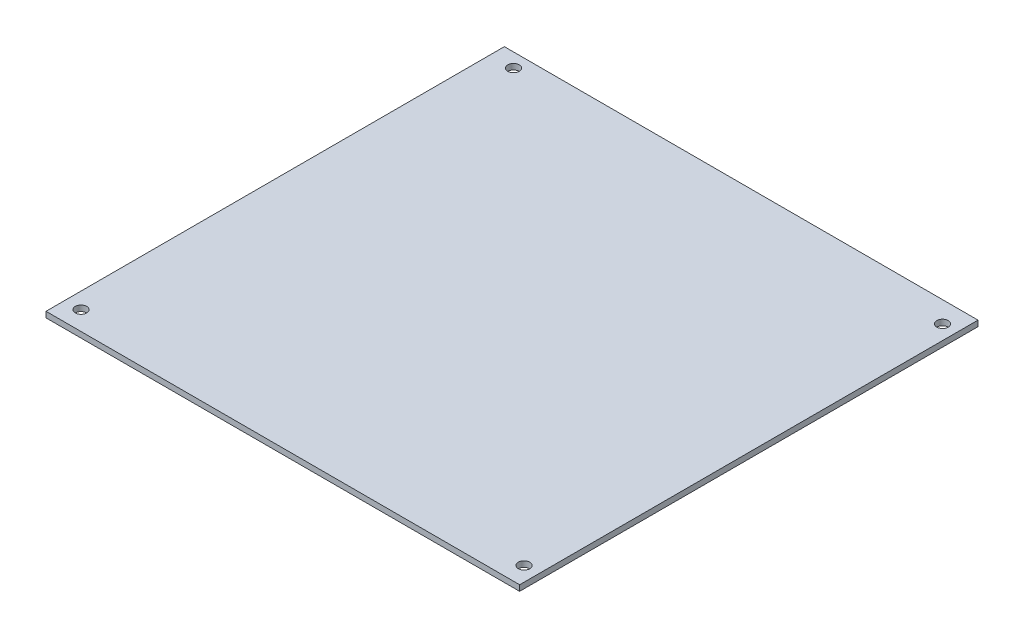
ISO-10303-21;
HEADER;
FILE_DESCRIPTION(('STEP AP214'),'2;1');
FILE_NAME('part.step','',(''),(''),'','','');
FILE_SCHEMA(('AUTOMOTIVE_DESIGN { 1 0 10303 214 1 1 1 1 }'));
ENDSEC;
DATA;
#1=APPLICATION_CONTEXT('core data for automotive mechanical design processes');
#2=APPLICATION_PROTOCOL_DEFINITION('international standard','automotive_design',2000,#1);
#3=PRODUCT_CONTEXT('',#1,'mechanical');
#4=PRODUCT('Part','Part','',(#3));
#5=PRODUCT_RELATED_PRODUCT_CATEGORY('part','',(#4));
#6=PRODUCT_DEFINITION_FORMATION('','',#4);
#7=PRODUCT_DEFINITION_CONTEXT('part definition',#1,'design');
#8=PRODUCT_DEFINITION('design','',#6,#7);
#9=PRODUCT_DEFINITION_SHAPE('','',#8);
#10=(LENGTH_UNIT() NAMED_UNIT(*) SI_UNIT(.MILLI.,.METRE.));
#11=(NAMED_UNIT(*) PLANE_ANGLE_UNIT() SI_UNIT($,.RADIAN.));
#12=(NAMED_UNIT(*) SI_UNIT($,.STERADIAN.) SOLID_ANGLE_UNIT());
#13=UNCERTAINTY_MEASURE_WITH_UNIT(LENGTH_MEASURE(1.E-05),#10,'distance_accuracy_value','');
#14=(GEOMETRIC_REPRESENTATION_CONTEXT(3) GLOBAL_UNCERTAINTY_ASSIGNED_CONTEXT((#13)) GLOBAL_UNIT_ASSIGNED_CONTEXT((#10,
#11,#12)) REPRESENTATION_CONTEXT('',''));
#15=CARTESIAN_POINT('',(0.,0.,0.));
#16=DIRECTION('',(0.,0.,1.));
#17=DIRECTION('',(1.,0.,0.));
#18=AXIS2_PLACEMENT_3D('',#15,#16,#17);
#19=CARTESIAN_POINT('',(0.,1.5,0.));
#20=DIRECTION('',(0.,1.,0.));
#21=DIRECTION('',(0.,0.,1.));
#22=AXIS2_PLACEMENT_3D('',#19,#20,#21);
#23=PLANE('',#22);
#24=CARTESIAN_POINT('',(-57.7847884567712,1.5,55.0521093853193));
#25=DIRECTION('',(0.,1.,0.));
#26=DIRECTION('',(0.,0.,1.));
#27=AXIS2_PLACEMENT_3D('',#24,#25,#26);
#28=CIRCLE('',#27,1.5);
#29=CARTESIAN_POINT('',(-57.7847884567712,1.5,56.5521093853193));
#30=VERTEX_POINT('',#29);
#31=EDGE_CURVE('E125',#30,#30,#28,.F.);
#32=ORIENTED_EDGE('',*,*,#31,.T.);
#33=EDGE_LOOP('',(#32));
#34=FACE_BOUND('',#33,.T.);
#35=CARTESIAN_POINT('',(-55.9413505060807,1.5,-56.3455510155177));
#36=DIRECTION('',(0.,1.,0.));
#37=DIRECTION('',(0.,0.,1.));
#38=AXIS2_PLACEMENT_3D('',#35,#36,#37);
#39=CIRCLE('',#38,1.5);
#40=CARTESIAN_POINT('',(-55.9413505060807,1.5,-54.8455510155177));
#41=VERTEX_POINT('',#40);
#42=EDGE_CURVE('E102',#41,#41,#39,.F.);
#43=ORIENTED_EDGE('',*,*,#42,.T.);
#44=EDGE_LOOP('',(#43));
#45=FACE_BOUND('',#44,.T.);
#46=DIRECTION('',(0.,0.,-1.));
#47=VECTOR('',#46,1.);
#48=CARTESIAN_POINT('',(62.,1.5,-60.));
#49=LINE('',#48,#47);
#50=CARTESIAN_POINT('',(62.,1.5,60.));
#51=VERTEX_POINT('',#50);
#52=CARTESIAN_POINT('',(62.,1.5,-60.));
#53=VERTEX_POINT('',#52);
#54=EDGE_CURVE('E87',#51,#53,#49,.T.);
#55=ORIENTED_EDGE('',*,*,#54,.T.);
#56=DIRECTION('',(-1.,0.,0.));
#57=VECTOR('',#56,1.);
#58=CARTESIAN_POINT('',(-62.,1.5,-60.));
#59=LINE('',#58,#57);
#60=CARTESIAN_POINT('',(-62.,1.5,-60.));
#61=VERTEX_POINT('',#60);
#62=EDGE_CURVE('E82',#53,#61,#59,.T.);
#63=ORIENTED_EDGE('',*,*,#62,.T.);
#64=DIRECTION('',(0.,0.,1.));
#65=VECTOR('',#64,1.);
#66=CARTESIAN_POINT('',(-62.,1.5,-60.));
#67=LINE('',#66,#65);
#68=CARTESIAN_POINT('',(-62.,1.5,60.));
#69=VERTEX_POINT('',#68);
#70=EDGE_CURVE('E85',#61,#69,#67,.T.);
#71=ORIENTED_EDGE('',*,*,#70,.T.);
#72=DIRECTION('',(1.,0.,0.));
#73=VECTOR('',#72,1.);
#74=CARTESIAN_POINT('',(-62.,1.5,60.));
#75=LINE('',#74,#73);
#76=EDGE_CURVE('E52',#69,#51,#75,.T.);
#77=ORIENTED_EDGE('',*,*,#76,.T.);
#78=EDGE_LOOP('',(#55,#63,#71,#77));
#79=FACE_BOUND('',#78,.T.);
#80=CARTESIAN_POINT('',(58.2048733589279,1.5,-54.5021130648272));
#81=DIRECTION('',(0.,1.,0.));
#82=DIRECTION('',(0.,0.,1.));
#83=AXIS2_PLACEMENT_3D('',#80,#81,#82);
#84=CIRCLE('',#83,1.5);
#85=CARTESIAN_POINT('',(58.2048733589279,1.5,-53.0021130648272));
#86=VERTEX_POINT('',#85);
#87=EDGE_CURVE('E119',#86,#86,#84,.F.);
#88=ORIENTED_EDGE('',*,*,#87,.T.);
#89=EDGE_LOOP('',(#88));
#90=FACE_BOUND('',#89,.T.);
#91=CARTESIAN_POINT('',(58.2048733589279,1.5,55.0521093853193));
#92=DIRECTION('',(0.,1.,0.));
#93=DIRECTION('',(0.,0.,1.));
#94=AXIS2_PLACEMENT_3D('',#91,#92,#93);
#95=CIRCLE('',#94,1.5);
#96=CARTESIAN_POINT('',(58.2048733589279,1.5,56.5521093853193));
#97=VERTEX_POINT('',#96);
#98=EDGE_CURVE('E131',#97,#97,#95,.F.);
#99=ORIENTED_EDGE('',*,*,#98,.T.);
#100=EDGE_LOOP('',(#99));
#101=FACE_BOUND('',#100,.T.);
#102=ADVANCED_FACE('F35',(#34,#45,#79,#90,#101),#23,.T.);
#103=CARTESIAN_POINT('',(0.,0.,0.));
#104=DIRECTION('',(0.,1.,0.));
#105=DIRECTION('',(0.,0.,1.));
#106=AXIS2_PLACEMENT_3D('',#103,#104,#105);
#107=PLANE('',#106);
#108=CARTESIAN_POINT('',(-57.7847884567712,0.,55.0521093853193));
#109=DIRECTION('',(0.,1.,0.));
#110=DIRECTION('',(0.,0.,1.));
#111=AXIS2_PLACEMENT_3D('',#108,#109,#110);
#112=CIRCLE('',#111,1.5);
#113=CARTESIAN_POINT('',(-57.7847884567712,0.,56.5521093853193));
#114=VERTEX_POINT('',#113);
#115=EDGE_CURVE('E128',#114,#114,#112,.T.);
#116=ORIENTED_EDGE('',*,*,#115,.T.);
#117=EDGE_LOOP('',(#116));
#118=FACE_BOUND('',#117,.T.);
#119=CARTESIAN_POINT('',(-55.9413505060807,0.,-56.3455510155177));
#120=DIRECTION('',(0.,1.,0.));
#121=DIRECTION('',(0.,0.,1.));
#122=AXIS2_PLACEMENT_3D('',#119,#120,#121);
#123=CIRCLE('',#122,1.5);
#124=CARTESIAN_POINT('',(-55.9413505060807,0.,-54.8455510155177));
#125=VERTEX_POINT('',#124);
#126=EDGE_CURVE('E116',#125,#125,#123,.T.);
#127=ORIENTED_EDGE('',*,*,#126,.T.);
#128=EDGE_LOOP('',(#127));
#129=FACE_BOUND('',#128,.T.);
#130=DIRECTION('',(0.,0.,-1.));
#131=VECTOR('',#130,1.);
#132=CARTESIAN_POINT('',(62.,0.,-60.));
#133=LINE('',#132,#131);
#134=CARTESIAN_POINT('',(62.,0.,60.));
#135=VERTEX_POINT('',#134);
#136=CARTESIAN_POINT('',(62.,0.,-60.));
#137=VERTEX_POINT('',#136);
#138=EDGE_CURVE('E99',#135,#137,#133,.T.);
#139=ORIENTED_EDGE('',*,*,#138,.F.);
#140=DIRECTION('',(1.,0.,0.));
#141=VECTOR('',#140,1.);
#142=CARTESIAN_POINT('',(-62.,0.,60.));
#143=LINE('',#142,#141);
#144=CARTESIAN_POINT('',(-62.,0.,60.));
#145=VERTEX_POINT('',#144);
#146=EDGE_CURVE('E75',#145,#135,#143,.T.);
#147=ORIENTED_EDGE('',*,*,#146,.F.);
#148=DIRECTION('',(0.,0.,1.));
#149=VECTOR('',#148,1.);
#150=CARTESIAN_POINT('',(-62.,0.,-60.));
#151=LINE('',#150,#149);
#152=CARTESIAN_POINT('',(-62.,0.,-60.));
#153=VERTEX_POINT('',#152);
#154=EDGE_CURVE('E69',#153,#145,#151,.T.);
#155=ORIENTED_EDGE('',*,*,#154,.F.);
#156=DIRECTION('',(-1.,0.,0.));
#157=VECTOR('',#156,1.);
#158=CARTESIAN_POINT('',(-62.,0.,-60.));
#159=LINE('',#158,#157);
#160=EDGE_CURVE('E91',#137,#153,#159,.T.);
#161=ORIENTED_EDGE('',*,*,#160,.F.);
#162=EDGE_LOOP('',(#139,#147,#155,#161));
#163=FACE_BOUND('',#162,.T.);
#164=CARTESIAN_POINT('',(58.2048733589279,0.,-54.5021130648272));
#165=DIRECTION('',(0.,1.,0.));
#166=DIRECTION('',(0.,0.,1.));
#167=AXIS2_PLACEMENT_3D('',#164,#165,#166);
#168=CIRCLE('',#167,1.5);
#169=CARTESIAN_POINT('',(58.2048733589279,0.,-53.0021130648272));
#170=VERTEX_POINT('',#169);
#171=EDGE_CURVE('E122',#170,#170,#168,.T.);
#172=ORIENTED_EDGE('',*,*,#171,.T.);
#173=EDGE_LOOP('',(#172));
#174=FACE_BOUND('',#173,.T.);
#175=CARTESIAN_POINT('',(58.2048733589279,0.,55.0521093853193));
#176=DIRECTION('',(0.,1.,0.));
#177=DIRECTION('',(0.,0.,1.));
#178=AXIS2_PLACEMENT_3D('',#175,#176,#177);
#179=CIRCLE('',#178,1.5);
#180=CARTESIAN_POINT('',(58.2048733589279,0.,56.5521093853193));
#181=VERTEX_POINT('',#180);
#182=EDGE_CURVE('E134',#181,#181,#179,.T.);
#183=ORIENTED_EDGE('',*,*,#182,.T.);
#184=EDGE_LOOP('',(#183));
#185=FACE_BOUND('',#184,.T.);
#186=ADVANCED_FACE('F110',(#118,#129,#163,#174,#185),#107,.F.);
#187=CARTESIAN_POINT('',(62.,1.5,-60.));
#188=DIRECTION('',(-1.,0.,0.));
#189=DIRECTION('',(0.,0.,1.));
#190=AXIS2_PLACEMENT_3D('',#187,#188,#189);
#191=PLANE('',#190);
#192=ORIENTED_EDGE('',*,*,#138,.T.);
#193=DIRECTION('',(0.,-1.,0.));
#194=VECTOR('',#193,1.);
#195=CARTESIAN_POINT('',(62.,1.5,-60.));
#196=LINE('',#195,#194);
#197=EDGE_CURVE('E11',#53,#137,#196,.T.);
#198=ORIENTED_EDGE('',*,*,#197,.F.);
#199=ORIENTED_EDGE('',*,*,#54,.F.);
#200=DIRECTION('',(0.,-1.,0.));
#201=VECTOR('',#200,1.);
#202=CARTESIAN_POINT('',(62.,1.5,60.));
#203=LINE('',#202,#201);
#204=EDGE_CURVE('E95',#51,#135,#203,.T.);
#205=ORIENTED_EDGE('',*,*,#204,.T.);
#206=EDGE_LOOP('',(#192,#198,#199,#205));
#207=FACE_BOUND('',#206,.T.);
#208=ADVANCED_FACE('F37',(#207),#191,.F.);
#209=CARTESIAN_POINT('',(-62.,1.5,-60.));
#210=DIRECTION('',(0.,0.,1.));
#211=DIRECTION('',(1.,0.,0.));
#212=AXIS2_PLACEMENT_3D('',#209,#210,#211);
#213=PLANE('',#212);
#214=ORIENTED_EDGE('',*,*,#160,.T.);
#215=DIRECTION('',(0.,-1.,0.));
#216=VECTOR('',#215,1.);
#217=CARTESIAN_POINT('',(-62.,1.5,-60.));
#218=LINE('',#217,#216);
#219=EDGE_CURVE('E44',#61,#153,#218,.T.);
#220=ORIENTED_EDGE('',*,*,#219,.F.);
#221=ORIENTED_EDGE('',*,*,#62,.F.);
#222=ORIENTED_EDGE('',*,*,#197,.T.);
#223=EDGE_LOOP('',(#214,#220,#221,#222));
#224=FACE_BOUND('',#223,.T.);
#225=ADVANCED_FACE('F90',(#224),#213,.F.);
#226=CARTESIAN_POINT('',(-62.,1.5,-60.));
#227=DIRECTION('',(1.,0.,0.));
#228=DIRECTION('',(0.,0.,-1.));
#229=AXIS2_PLACEMENT_3D('',#226,#227,#228);
#230=PLANE('',#229);
#231=ORIENTED_EDGE('',*,*,#154,.T.);
#232=DIRECTION('',(0.,-1.,0.));
#233=VECTOR('',#232,1.);
#234=CARTESIAN_POINT('',(-62.,1.5,60.));
#235=LINE('',#234,#233);
#236=EDGE_CURVE('E92',#69,#145,#235,.T.);
#237=ORIENTED_EDGE('',*,*,#236,.F.);
#238=ORIENTED_EDGE('',*,*,#70,.F.);
#239=ORIENTED_EDGE('',*,*,#219,.T.);
#240=EDGE_LOOP('',(#231,#237,#238,#239));
#241=FACE_BOUND('',#240,.T.);
#242=ADVANCED_FACE('F93',(#241),#230,.F.);
#243=CARTESIAN_POINT('',(-62.,1.5,60.));
#244=DIRECTION('',(0.,0.,-1.));
#245=DIRECTION('',(-1.,0.,0.));
#246=AXIS2_PLACEMENT_3D('',#243,#244,#245);
#247=PLANE('',#246);
#248=ORIENTED_EDGE('',*,*,#146,.T.);
#249=ORIENTED_EDGE('',*,*,#204,.F.);
#250=ORIENTED_EDGE('',*,*,#76,.F.);
#251=ORIENTED_EDGE('',*,*,#236,.T.);
#252=EDGE_LOOP('',(#248,#249,#250,#251));
#253=FACE_BOUND('',#252,.T.);
#254=ADVANCED_FACE('F107',(#253),#247,.F.);
#255=CARTESIAN_POINT('',(-55.9413505060807,8.5,-56.3455510155177));
#256=DIRECTION('',(0.,-1.,0.));
#257=DIRECTION('',(0.,0.,-1.));
#258=AXIS2_PLACEMENT_3D('',#255,#256,#257);
#259=CYLINDRICAL_SURFACE('',#258,1.5);
#260=ORIENTED_EDGE('',*,*,#42,.F.);
#261=EDGE_LOOP('',(#260));
#262=FACE_BOUND('',#261,.T.);
#263=ORIENTED_EDGE('',*,*,#126,.F.);
#264=EDGE_LOOP('',(#263));
#265=FACE_BOUND('',#264,.T.);
#266=ADVANCED_FACE('F161',(#262,#265),#259,.F.);
#267=CARTESIAN_POINT('',(58.2048733589279,8.5,-54.5021130648272));
#268=DIRECTION('',(0.,-1.,0.));
#269=DIRECTION('',(0.,0.,-1.));
#270=AXIS2_PLACEMENT_3D('',#267,#268,#269);
#271=CYLINDRICAL_SURFACE('',#270,1.5);
#272=ORIENTED_EDGE('',*,*,#87,.F.);
#273=EDGE_LOOP('',(#272));
#274=FACE_BOUND('',#273,.T.);
#275=ORIENTED_EDGE('',*,*,#171,.F.);
#276=EDGE_LOOP('',(#275));
#277=FACE_BOUND('',#276,.T.);
#278=ADVANCED_FACE('F147',(#274,#277),#271,.F.);
#279=CARTESIAN_POINT('',(-57.7847884567712,8.5,55.0521093853193));
#280=DIRECTION('',(0.,-1.,0.));
#281=DIRECTION('',(0.,0.,-1.));
#282=AXIS2_PLACEMENT_3D('',#279,#280,#281);
#283=CYLINDRICAL_SURFACE('',#282,1.5);
#284=ORIENTED_EDGE('',*,*,#31,.F.);
#285=EDGE_LOOP('',(#284));
#286=FACE_BOUND('',#285,.T.);
#287=ORIENTED_EDGE('',*,*,#115,.F.);
#288=EDGE_LOOP('',(#287));
#289=FACE_BOUND('',#288,.T.);
#290=ADVANCED_FACE('F141',(#286,#289),#283,.F.);
#291=CARTESIAN_POINT('',(58.2048733589279,8.5,55.0521093853193));
#292=DIRECTION('',(0.,-1.,0.));
#293=DIRECTION('',(0.,0.,-1.));
#294=AXIS2_PLACEMENT_3D('',#291,#292,#293);
#295=CYLINDRICAL_SURFACE('',#294,1.5);
#296=ORIENTED_EDGE('',*,*,#98,.F.);
#297=EDGE_LOOP('',(#296));
#298=FACE_BOUND('',#297,.T.);
#299=ORIENTED_EDGE('',*,*,#182,.F.);
#300=EDGE_LOOP('',(#299));
#301=FACE_BOUND('',#300,.T.);
#302=ADVANCED_FACE('F139',(#298,#301),#295,.F.);
#303=CLOSED_SHELL('',(#102,#186,#208,#225,#242,#254,#266,#278,#290,#302));
#304=MANIFOLD_SOLID_BREP('B2',#303);
#305=ADVANCED_BREP_SHAPE_REPRESENTATION('',(#18,#304),#14);
#306=SHAPE_DEFINITION_REPRESENTATION(#9,#305);
ENDSEC;
END-ISO-10303-21;
